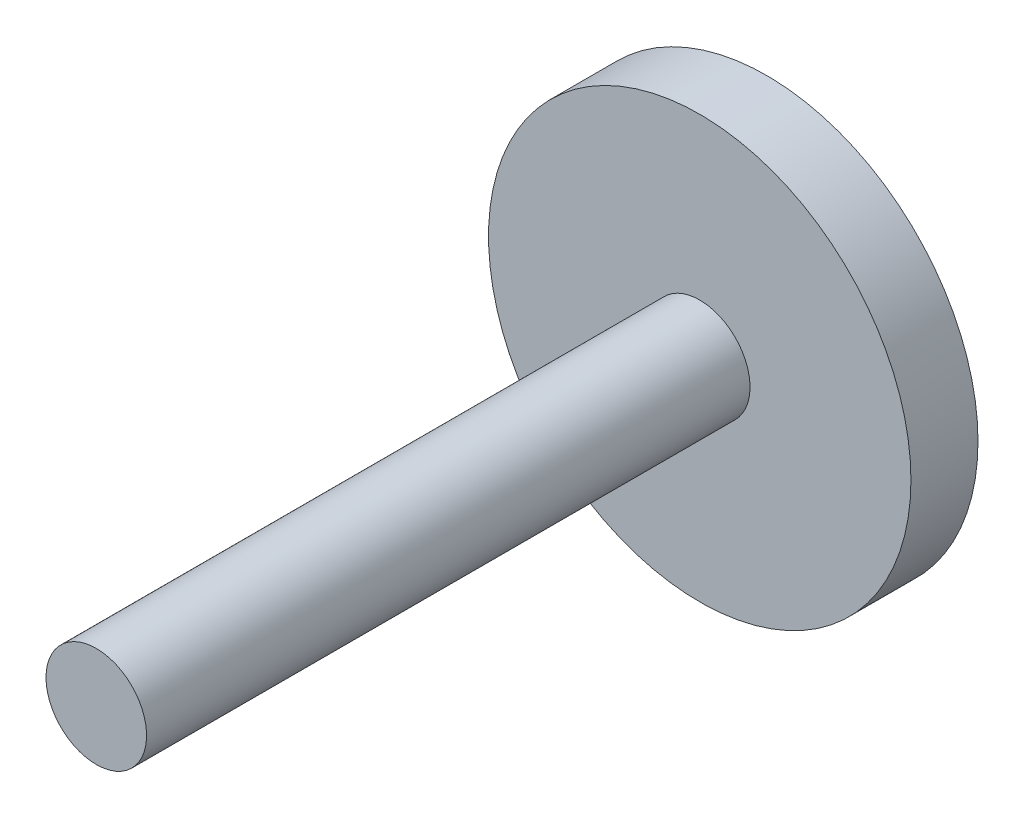
ISO-10303-21;
HEADER;
FILE_DESCRIPTION(('STEP AP214'),'2;1');
FILE_NAME('part.step','',(''),(''),'','','');
FILE_SCHEMA(('AUTOMOTIVE_DESIGN { 1 0 10303 214 1 1 1 1 }'));
ENDSEC;
DATA;
#1=APPLICATION_CONTEXT('core data for automotive mechanical design processes');
#2=APPLICATION_PROTOCOL_DEFINITION('international standard','automotive_design',2000,#1);
#3=PRODUCT_CONTEXT('',#1,'mechanical');
#4=PRODUCT('Part','Part','',(#3));
#5=PRODUCT_RELATED_PRODUCT_CATEGORY('part','',(#4));
#6=PRODUCT_DEFINITION_FORMATION('','',#4);
#7=PRODUCT_DEFINITION_CONTEXT('part definition',#1,'design');
#8=PRODUCT_DEFINITION('design','',#6,#7);
#9=PRODUCT_DEFINITION_SHAPE('','',#8);
#10=(LENGTH_UNIT() NAMED_UNIT(*) SI_UNIT(.MILLI.,.METRE.));
#11=(NAMED_UNIT(*) PLANE_ANGLE_UNIT() SI_UNIT($,.RADIAN.));
#12=(NAMED_UNIT(*) SI_UNIT($,.STERADIAN.) SOLID_ANGLE_UNIT());
#13=UNCERTAINTY_MEASURE_WITH_UNIT(LENGTH_MEASURE(1.E-05),#10,'distance_accuracy_value','');
#14=(GEOMETRIC_REPRESENTATION_CONTEXT(3) GLOBAL_UNCERTAINTY_ASSIGNED_CONTEXT((#13)) GLOBAL_UNIT_ASSIGNED_CONTEXT((#10,
#11,#12)) REPRESENTATION_CONTEXT('',''));
#15=CARTESIAN_POINT('',(0.,0.,0.));
#16=DIRECTION('',(0.,0.,1.));
#17=DIRECTION('',(1.,0.,0.));
#18=AXIS2_PLACEMENT_3D('',#15,#16,#17);
#19=CARTESIAN_POINT('',(0.,0.,10.));
#20=DIRECTION('',(0.,0.,-1.));
#21=DIRECTION('',(-1.,0.,0.));
#22=AXIS2_PLACEMENT_3D('',#19,#20,#21);
#23=CYLINDRICAL_SURFACE('',#22,31.5);
#24=CARTESIAN_POINT('',(0.,0.,10.));
#25=DIRECTION('',(0.,0.,1.));
#26=DIRECTION('',(1.,0.,0.));
#27=AXIS2_PLACEMENT_3D('',#24,#25,#26);
#28=CIRCLE('',#27,31.5);
#29=CARTESIAN_POINT('',(31.5,0.,10.));
#30=VERTEX_POINT('',#29);
#31=EDGE_CURVE('E10',#30,#30,#28,.T.);
#32=ORIENTED_EDGE('',*,*,#31,.F.);
#33=EDGE_LOOP('',(#32));
#34=FACE_BOUND('',#33,.T.);
#35=CARTESIAN_POINT('',(0.,0.,0.));
#36=DIRECTION('',(0.,0.,1.));
#37=DIRECTION('',(1.,0.,0.));
#38=AXIS2_PLACEMENT_3D('',#35,#36,#37);
#39=CIRCLE('',#38,31.5);
#40=CARTESIAN_POINT('',(31.5,0.,0.));
#41=VERTEX_POINT('',#40);
#42=EDGE_CURVE('E40',#41,#41,#39,.T.);
#43=ORIENTED_EDGE('',*,*,#42,.T.);
#44=EDGE_LOOP('',(#43));
#45=FACE_BOUND('',#44,.T.);
#46=ADVANCED_FACE('F37',(#34,#45),#23,.T.);
#47=CARTESIAN_POINT('',(0.,0.,10.));
#48=DIRECTION('',(0.,0.,1.));
#49=DIRECTION('',(1.,0.,0.));
#50=AXIS2_PLACEMENT_3D('',#47,#48,#49);
#51=PLANE('',#50);
#52=CARTESIAN_POINT('',(0.,0.,9.99999999999999));
#53=DIRECTION('',(0.,0.,1.));
#54=DIRECTION('',(1.,0.,0.));
#55=AXIS2_PLACEMENT_3D('',#52,#53,#54);
#56=CIRCLE('',#55,7.5);
#57=CARTESIAN_POINT('',(-7.5,0.,9.99999999999998));
#58=VERTEX_POINT('',#57);
#59=EDGE_CURVE('E47',#58,#58,#56,.F.);
#60=ORIENTED_EDGE('',*,*,#59,.T.);
#61=EDGE_LOOP('',(#60));
#62=FACE_BOUND('',#61,.T.);
#63=ORIENTED_EDGE('',*,*,#31,.T.);
#64=EDGE_LOOP('',(#63));
#65=FACE_BOUND('',#64,.T.);
#66=ADVANCED_FACE('F67',(#62,#65),#51,.T.);
#67=CARTESIAN_POINT('',(0.,0.,0.));
#68=DIRECTION('',(0.,0.,1.));
#69=DIRECTION('',(1.,0.,0.));
#70=AXIS2_PLACEMENT_3D('',#67,#68,#69);
#71=PLANE('',#70);
#72=ORIENTED_EDGE('',*,*,#42,.F.);
#73=EDGE_LOOP('',(#72));
#74=FACE_BOUND('',#73,.T.);
#75=ADVANCED_FACE('F59',(#74),#71,.F.);
#76=CARTESIAN_POINT('',(0.,0.,100.));
#77=DIRECTION('',(0.,0.,-1.));
#78=DIRECTION('',(-1.,0.,0.));
#79=AXIS2_PLACEMENT_3D('',#76,#77,#78);
#80=CYLINDRICAL_SURFACE('',#79,7.5);
#81=CARTESIAN_POINT('',(0.,0.,100.));
#82=DIRECTION('',(0.,0.,1.));
#83=DIRECTION('',(1.,0.,0.));
#84=AXIS2_PLACEMENT_3D('',#81,#82,#83);
#85=CIRCLE('',#84,7.5);
#86=CARTESIAN_POINT('',(-7.5,0.,100.));
#87=VERTEX_POINT('',#86);
#88=EDGE_CURVE('E51',#87,#87,#85,.T.);
#89=CARTESIAN_POINT('',(-7.5,0.,9.99999999999998));
#90=CARTESIAN_POINT('',(-7.5,0.,10.9375));
#91=CARTESIAN_POINT('',(-7.5,0.,11.875));
#92=CARTESIAN_POINT('',(-7.5,0.,13.75));
#93=CARTESIAN_POINT('',(-7.5,0.,14.6875));
#94=CARTESIAN_POINT('',(-7.5,0.,16.5625));
#95=CARTESIAN_POINT('',(-7.5,0.,17.5));
#96=CARTESIAN_POINT('',(-7.5,0.,19.375));
#97=CARTESIAN_POINT('',(-7.5,0.,20.3125));
#98=CARTESIAN_POINT('',(-7.5,0.,22.1875));
#99=CARTESIAN_POINT('',(-7.5,0.,23.125));
#100=CARTESIAN_POINT('',(-7.5,0.,25.));
#101=CARTESIAN_POINT('',(-7.5,0.,25.9375));
#102=CARTESIAN_POINT('',(-7.5,0.,27.8125));
#103=CARTESIAN_POINT('',(-7.5,0.,28.75));
#104=CARTESIAN_POINT('',(-7.5,0.,30.625));
#105=CARTESIAN_POINT('',(-7.5,0.,31.5625));
#106=CARTESIAN_POINT('',(-7.5,0.,33.4375));
#107=CARTESIAN_POINT('',(-7.5,0.,34.375));
#108=CARTESIAN_POINT('',(-7.5,0.,36.25));
#109=CARTESIAN_POINT('',(-7.5,0.,37.1875));
#110=CARTESIAN_POINT('',(-7.5,0.,39.0625));
#111=CARTESIAN_POINT('',(-7.5,0.,40.));
#112=CARTESIAN_POINT('',(-7.5,0.,41.875));
#113=CARTESIAN_POINT('',(-7.5,0.,42.8125));
#114=CARTESIAN_POINT('',(-7.5,0.,44.6875));
#115=CARTESIAN_POINT('',(-7.5,0.,45.625));
#116=CARTESIAN_POINT('',(-7.5,0.,47.5));
#117=CARTESIAN_POINT('',(-7.5,0.,48.4375));
#118=CARTESIAN_POINT('',(-7.5,0.,50.3125));
#119=CARTESIAN_POINT('',(-7.5,0.,51.25));
#120=CARTESIAN_POINT('',(-7.5,0.,53.125));
#121=CARTESIAN_POINT('',(-7.5,0.,54.0625));
#122=CARTESIAN_POINT('',(-7.5,0.,55.9375));
#123=CARTESIAN_POINT('',(-7.5,0.,56.875));
#124=CARTESIAN_POINT('',(-7.5,0.,58.75));
#125=CARTESIAN_POINT('',(-7.5,0.,59.6875));
#126=CARTESIAN_POINT('',(-7.5,0.,61.5625));
#127=CARTESIAN_POINT('',(-7.5,0.,62.5));
#128=CARTESIAN_POINT('',(-7.5,0.,64.375));
#129=CARTESIAN_POINT('',(-7.5,0.,65.3125));
#130=CARTESIAN_POINT('',(-7.5,0.,67.1875));
#131=CARTESIAN_POINT('',(-7.5,0.,68.125));
#132=CARTESIAN_POINT('',(-7.5,0.,70.));
#133=CARTESIAN_POINT('',(-7.5,0.,70.9375));
#134=CARTESIAN_POINT('',(-7.5,0.,72.8125));
#135=CARTESIAN_POINT('',(-7.5,0.,73.75));
#136=CARTESIAN_POINT('',(-7.5,0.,75.625));
#137=CARTESIAN_POINT('',(-7.5,0.,76.5625));
#138=CARTESIAN_POINT('',(-7.5,0.,78.4375));
#139=CARTESIAN_POINT('',(-7.5,0.,79.375));
#140=CARTESIAN_POINT('',(-7.5,0.,81.25));
#141=CARTESIAN_POINT('',(-7.5,0.,82.1875));
#142=CARTESIAN_POINT('',(-7.5,0.,84.0625));
#143=CARTESIAN_POINT('',(-7.5,0.,85.));
#144=CARTESIAN_POINT('',(-7.5,0.,86.875));
#145=CARTESIAN_POINT('',(-7.5,0.,87.8125));
#146=CARTESIAN_POINT('',(-7.5,0.,89.6875));
#147=CARTESIAN_POINT('',(-7.5,0.,90.625));
#148=CARTESIAN_POINT('',(-7.5,0.,92.5));
#149=CARTESIAN_POINT('',(-7.5,0.,93.4375));
#150=CARTESIAN_POINT('',(-7.5,0.,95.3125));
#151=CARTESIAN_POINT('',(-7.5,0.,96.25));
#152=CARTESIAN_POINT('',(-7.5,0.,98.125));
#153=CARTESIAN_POINT('',(-7.5,0.,99.0625));
#154=CARTESIAN_POINT('',(-7.5,0.,100.));
#155=B_SPLINE_CURVE_WITH_KNOTS('',3,(#89,#90,#91,#92,#93,#94,#95,#96,#97,#98,#99,#100,#101,#102,
#103,#104,#105,#106,#107,#108,#109,#110,#111,#112,#113,#114,#115,#116,#117,#118,#119,#120,#121,
#122,#123,#124,#125,#126,#127,#128,#129,#130,#131,#132,#133,#134,#135,#136,#137,#138,#139,#140,
#141,#142,#143,#144,#145,#146,#147,#148,#149,#150,#151,#152,#153,#154),.UNSPECIFIED.,.F.,.F.,(4,
2,2,2,2,2,2,2,2,2,2,2,2,2,2,2,2,2,2,2,2,2,2,2,2,2,2,2,2,2,2,2,4),(0.,2.8125,5.62500000000001,
8.4375,11.25,14.0625,16.875,19.6875,22.5,25.3125,28.125,30.9375,33.75,36.5625,39.375,42.1875,
45.,47.8125,50.625,53.4375,56.25,59.0625,61.875,64.6875,67.5,70.3125,73.125,75.9375,78.75,
81.5625,84.375,87.1875,90.),.UNSPECIFIED.);
#156=EDGE_CURVE('BSEAM57',#58,#87,#155,.T.);
#157=ORIENTED_EDGE('',*,*,#59,.F.);
#158=ORIENTED_EDGE('',*,*,#88,.F.);
#159=ORIENTED_EDGE('',*,*,#156,.T.);
#160=ORIENTED_EDGE('',*,*,#156,.F.);
#161=EDGE_LOOP('',(#157,#159,#158,#160));
#162=FACE_BOUND('',#161,.T.);
#163=ADVANCED_FACE('F57',(#162),#80,.T.);
#164=CARTESIAN_POINT('',(0.,0.,100.));
#165=DIRECTION('',(0.,0.,1.));
#166=DIRECTION('',(1.,0.,0.));
#167=AXIS2_PLACEMENT_3D('',#164,#165,#166);
#168=PLANE('',#167);
#169=ORIENTED_EDGE('',*,*,#88,.T.);
#170=EDGE_LOOP('',(#169));
#171=FACE_BOUND('',#170,.T.);
#172=ADVANCED_FACE('F55',(#171),#168,.T.);
#173=CLOSED_SHELL('',(#46,#66,#75,#163,#172));
#174=MANIFOLD_SOLID_BREP('B2',#173);
#175=ADVANCED_BREP_SHAPE_REPRESENTATION('',(#18,#174),#14);
#176=SHAPE_DEFINITION_REPRESENTATION(#9,#175);
ENDSEC;
END-ISO-10303-21;
